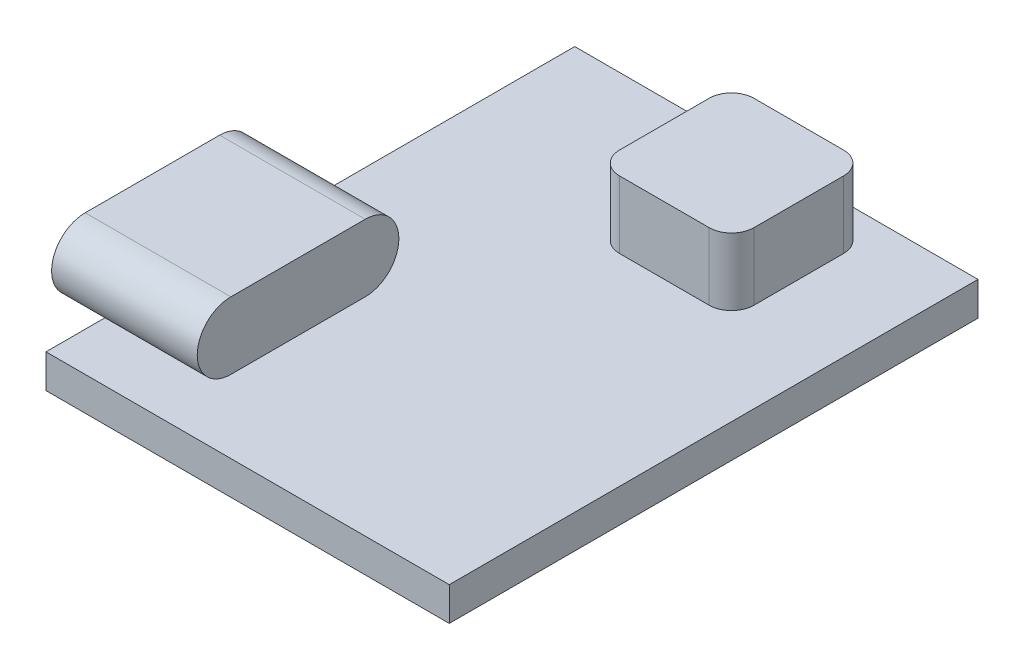
ISO-10303-21;
HEADER;
FILE_DESCRIPTION(('STEP AP214'),'2;1');
FILE_NAME('part.step','',(''),(''),'','','');
FILE_SCHEMA(('AUTOMOTIVE_DESIGN { 1 0 10303 214 1 1 1 1 }'));
ENDSEC;
DATA;
#1=APPLICATION_CONTEXT('core data for automotive mechanical design processes');
#2=APPLICATION_PROTOCOL_DEFINITION('international standard','automotive_design',2000,#1);
#3=PRODUCT_CONTEXT('',#1,'mechanical');
#4=PRODUCT('Part','Part','',(#3));
#5=PRODUCT_RELATED_PRODUCT_CATEGORY('part','',(#4));
#6=PRODUCT_DEFINITION_FORMATION('','',#4);
#7=PRODUCT_DEFINITION_CONTEXT('part definition',#1,'design');
#8=PRODUCT_DEFINITION('design','',#6,#7);
#9=PRODUCT_DEFINITION_SHAPE('','',#8);
#10=(LENGTH_UNIT() NAMED_UNIT(*) SI_UNIT(.MILLI.,.METRE.));
#11=(NAMED_UNIT(*) PLANE_ANGLE_UNIT() SI_UNIT($,.RADIAN.));
#12=(NAMED_UNIT(*) SI_UNIT($,.STERADIAN.) SOLID_ANGLE_UNIT());
#13=UNCERTAINTY_MEASURE_WITH_UNIT(LENGTH_MEASURE(1.E-05),#10,'distance_accuracy_value','');
#14=(GEOMETRIC_REPRESENTATION_CONTEXT(3) GLOBAL_UNCERTAINTY_ASSIGNED_CONTEXT((#13)) GLOBAL_UNIT_ASSIGNED_CONTEXT((#10,
#11,#12)) REPRESENTATION_CONTEXT('',''));
#15=CARTESIAN_POINT('',(0.,0.,0.));
#16=DIRECTION('',(0.,0.,1.));
#17=DIRECTION('',(1.,0.,0.));
#18=AXIS2_PLACEMENT_3D('',#15,#16,#17);
#19=CARTESIAN_POINT('',(-1.,4.5,-10.8));
#20=DIRECTION('',(1.,0.,0.));
#21=DIRECTION('',(0.,0.,-1.));
#22=AXIS2_PLACEMENT_3D('',#19,#20,#21);
#23=PLANE('',#22);
#24=DIRECTION('',(0.,0.,1.));
#25=VECTOR('',#24,1.);
#26=CARTESIAN_POINT('',(-1.,4.5,-10.8));
#27=LINE('',#26,#25);
#28=CARTESIAN_POINT('',(-1.,4.5,-9.8));
#29=VERTEX_POINT('',#28);
#30=CARTESIAN_POINT('',(-1.,4.5,-5.8));
#31=VERTEX_POINT('',#30);
#32=EDGE_CURVE('E144',#29,#31,#27,.T.);
#33=ORIENTED_EDGE('',*,*,#32,.F.);
#34=DIRECTION('',(0.,-1.,0.));
#35=VECTOR('',#34,1.);
#36=CARTESIAN_POINT('',(-1.,4.5,-9.8));
#37=LINE('',#36,#35);
#38=CARTESIAN_POINT('',(-1.,1.5,-9.8));
#39=VERTEX_POINT('',#38);
#40=EDGE_CURVE('E170',#29,#39,#37,.T.);
#41=ORIENTED_EDGE('',*,*,#40,.T.);
#42=DIRECTION('',(0.,0.,1.));
#43=VECTOR('',#42,1.);
#44=CARTESIAN_POINT('',(-1.,1.5,-10.8));
#45=LINE('',#44,#43);
#46=CARTESIAN_POINT('',(-1.,1.5,-5.8));
#47=VERTEX_POINT('',#46);
#48=EDGE_CURVE('E176',#39,#47,#45,.T.);
#49=ORIENTED_EDGE('',*,*,#48,.T.);
#50=DIRECTION('',(0.,-1.,0.));
#51=VECTOR('',#50,1.);
#52=CARTESIAN_POINT('',(-1.,4.5,-5.8));
#53=LINE('',#52,#51);
#54=EDGE_CURVE('E168',#47,#31,#53,.F.);
#55=ORIENTED_EDGE('',*,*,#54,.T.);
#56=EDGE_LOOP('',(#33,#41,#49,#55));
#57=FACE_BOUND('',#56,.T.);
#58=ADVANCED_FACE('F52',(#57),#23,.F.);
#59=CARTESIAN_POINT('',(-1.,4.5,-4.8));
#60=DIRECTION('',(0.,0.,-1.));
#61=DIRECTION('',(-1.,0.,0.));
#62=AXIS2_PLACEMENT_3D('',#59,#60,#61);
#63=PLANE('',#62);
#64=DIRECTION('',(1.,0.,0.));
#65=VECTOR('',#64,1.);
#66=CARTESIAN_POINT('',(-1.,4.5,-4.8));
#67=LINE('',#66,#65);
#68=CARTESIAN_POINT('',(0.,4.5,-4.8));
#69=VERTEX_POINT('',#68);
#70=CARTESIAN_POINT('',(4.,4.5,-4.8));
#71=VERTEX_POINT('',#70);
#72=EDGE_CURVE('E147',#69,#71,#67,.T.);
#73=ORIENTED_EDGE('',*,*,#72,.F.);
#74=DIRECTION('',(0.,-1.,0.));
#75=VECTOR('',#74,1.);
#76=CARTESIAN_POINT('',(0.,4.5,-4.8));
#77=LINE('',#76,#75);
#78=CARTESIAN_POINT('',(0.,1.5,-4.8));
#79=VERTEX_POINT('',#78);
#80=EDGE_CURVE('E12',#69,#79,#77,.T.);
#81=ORIENTED_EDGE('',*,*,#80,.T.);
#82=DIRECTION('',(1.,0.,0.));
#83=VECTOR('',#82,1.);
#84=CARTESIAN_POINT('',(-1.,1.5,-4.8));
#85=LINE('',#84,#83);
#86=CARTESIAN_POINT('',(4.,1.5,-4.8));
#87=VERTEX_POINT('',#86);
#88=EDGE_CURVE('E149',#79,#87,#85,.T.);
#89=ORIENTED_EDGE('',*,*,#88,.T.);
#90=DIRECTION('',(0.,-1.,0.));
#91=VECTOR('',#90,1.);
#92=CARTESIAN_POINT('',(4.,4.5,-4.8));
#93=LINE('',#92,#91);
#94=EDGE_CURVE('E60',#87,#71,#93,.F.);
#95=ORIENTED_EDGE('',*,*,#94,.T.);
#96=EDGE_LOOP('',(#73,#81,#89,#95));
#97=FACE_BOUND('',#96,.T.);
#98=ADVANCED_FACE('F195',(#97),#63,.F.);
#99=CARTESIAN_POINT('',(5.,4.5,-10.8));
#100=DIRECTION('',(-1.,0.,0.));
#101=DIRECTION('',(0.,0.,1.));
#102=AXIS2_PLACEMENT_3D('',#99,#100,#101);
#103=PLANE('',#102);
#104=DIRECTION('',(0.,0.,-1.));
#105=VECTOR('',#104,1.);
#106=CARTESIAN_POINT('',(5.,1.5,-10.8));
#107=LINE('',#106,#105);
#108=CARTESIAN_POINT('',(5.,1.5,-5.8));
#109=VERTEX_POINT('',#108);
#110=CARTESIAN_POINT('',(5.,1.5,-9.8));
#111=VERTEX_POINT('',#110);
#112=EDGE_CURVE('E145',#109,#111,#107,.T.);
#113=ORIENTED_EDGE('',*,*,#112,.T.);
#114=DIRECTION('',(0.,-1.,0.));
#115=VECTOR('',#114,1.);
#116=CARTESIAN_POINT('',(5.,4.5,-9.8));
#117=LINE('',#116,#115);
#118=CARTESIAN_POINT('',(5.,4.5,-9.8));
#119=VERTEX_POINT('',#118);
#120=EDGE_CURVE('E123',#111,#119,#117,.F.);
#121=ORIENTED_EDGE('',*,*,#120,.T.);
#122=DIRECTION('',(0.,0.,-1.));
#123=VECTOR('',#122,1.);
#124=CARTESIAN_POINT('',(5.,4.5,-10.8));
#125=LINE('',#124,#123);
#126=CARTESIAN_POINT('',(5.,4.5,-5.8));
#127=VERTEX_POINT('',#126);
#128=EDGE_CURVE('E184',#127,#119,#125,.T.);
#129=ORIENTED_EDGE('',*,*,#128,.F.);
#130=DIRECTION('',(0.,-1.,0.));
#131=VECTOR('',#130,1.);
#132=CARTESIAN_POINT('',(5.,4.5,-5.8));
#133=LINE('',#132,#131);
#134=EDGE_CURVE('E128',#127,#109,#133,.T.);
#135=ORIENTED_EDGE('',*,*,#134,.T.);
#136=EDGE_LOOP('',(#113,#121,#129,#135));
#137=FACE_BOUND('',#136,.T.);
#138=ADVANCED_FACE('F194',(#137),#103,.F.);
#139=CARTESIAN_POINT('',(-1.,4.5,-10.8));
#140=DIRECTION('',(0.,0.,1.));
#141=DIRECTION('',(1.,0.,0.));
#142=AXIS2_PLACEMENT_3D('',#139,#140,#141);
#143=PLANE('',#142);
#144=DIRECTION('',(-1.,0.,0.));
#145=VECTOR('',#144,1.);
#146=CARTESIAN_POINT('',(-1.,4.5,-10.8));
#147=LINE('',#146,#145);
#148=CARTESIAN_POINT('',(4.,4.5,-10.8));
#149=VERTEX_POINT('',#148);
#150=CARTESIAN_POINT('',(0.,4.5,-10.8));
#151=VERTEX_POINT('',#150);
#152=EDGE_CURVE('E138',#149,#151,#147,.T.);
#153=ORIENTED_EDGE('',*,*,#152,.F.);
#154=DIRECTION('',(0.,-1.,0.));
#155=VECTOR('',#154,1.);
#156=CARTESIAN_POINT('',(4.,4.5,-10.8));
#157=LINE('',#156,#155);
#158=CARTESIAN_POINT('',(4.,1.5,-10.8));
#159=VERTEX_POINT('',#158);
#160=EDGE_CURVE('E122',#149,#159,#157,.T.);
#161=ORIENTED_EDGE('',*,*,#160,.T.);
#162=DIRECTION('',(-1.,0.,0.));
#163=VECTOR('',#162,1.);
#164=CARTESIAN_POINT('',(-1.,1.5,-10.8));
#165=LINE('',#164,#163);
#166=CARTESIAN_POINT('',(0.,1.5,-10.8));
#167=VERTEX_POINT('',#166);
#168=EDGE_CURVE('E135',#159,#167,#165,.T.);
#169=ORIENTED_EDGE('',*,*,#168,.T.);
#170=DIRECTION('',(0.,-1.,0.));
#171=VECTOR('',#170,1.);
#172=CARTESIAN_POINT('',(0.,4.5,-10.8));
#173=LINE('',#172,#171);
#174=EDGE_CURVE('E140',#167,#151,#173,.F.);
#175=ORIENTED_EDGE('',*,*,#174,.T.);
#176=EDGE_LOOP('',(#153,#161,#169,#175));
#177=FACE_BOUND('',#176,.T.);
#178=ADVANCED_FACE('F134',(#177),#143,.F.);
#179=CARTESIAN_POINT('',(0.,4.5,0.));
#180=DIRECTION('',(0.,1.,0.));
#181=DIRECTION('',(0.,0.,1.));
#182=AXIS2_PLACEMENT_3D('',#179,#180,#181);
#183=PLANE('',#182);
#184=ORIENTED_EDGE('',*,*,#128,.T.);
#185=CARTESIAN_POINT('',(4.,4.5,-9.8));
#186=DIRECTION('',(0.,1.,0.));
#187=DIRECTION('',(0.,0.,1.));
#188=AXIS2_PLACEMENT_3D('',#185,#186,#187);
#189=CIRCLE('',#188,1.);
#190=EDGE_CURVE('E166',#119,#149,#189,.T.);
#191=ORIENTED_EDGE('',*,*,#190,.T.);
#192=ORIENTED_EDGE('',*,*,#152,.T.);
#193=CARTESIAN_POINT('',(0.,4.5,-9.8));
#194=DIRECTION('',(0.,1.,0.));
#195=DIRECTION('',(0.,0.,1.));
#196=AXIS2_PLACEMENT_3D('',#193,#194,#195);
#197=CIRCLE('',#196,1.);
#198=EDGE_CURVE('E164',#151,#29,#197,.T.);
#199=ORIENTED_EDGE('',*,*,#198,.T.);
#200=ORIENTED_EDGE('',*,*,#32,.T.);
#201=CARTESIAN_POINT('',(0.,4.5,-5.8));
#202=DIRECTION('',(0.,1.,0.));
#203=DIRECTION('',(0.,0.,1.));
#204=AXIS2_PLACEMENT_3D('',#201,#202,#203);
#205=CIRCLE('',#204,1.);
#206=EDGE_CURVE('E73',#31,#69,#205,.T.);
#207=ORIENTED_EDGE('',*,*,#206,.T.);
#208=ORIENTED_EDGE('',*,*,#72,.T.);
#209=CARTESIAN_POINT('',(4.,4.5,-5.8));
#210=DIRECTION('',(0.,1.,0.));
#211=DIRECTION('',(0.,0.,1.));
#212=AXIS2_PLACEMENT_3D('',#209,#210,#211);
#213=CIRCLE('',#212,1.);
#214=EDGE_CURVE('E161',#71,#127,#213,.T.);
#215=ORIENTED_EDGE('',*,*,#214,.T.);
#216=EDGE_LOOP('',(#184,#191,#192,#199,#200,#207,#208,#215));
#217=FACE_BOUND('',#216,.T.);
#218=ADVANCED_FACE('F188',(#217),#183,.T.);
#219=CARTESIAN_POINT('',(0.,1.5,0.));
#220=DIRECTION('',(0.,1.,0.));
#221=DIRECTION('',(0.,0.,1.));
#222=AXIS2_PLACEMENT_3D('',#219,#220,#221);
#223=PLANE('',#222);
#224=ORIENTED_EDGE('',*,*,#168,.F.);
#225=CARTESIAN_POINT('',(4.,1.5,-9.8));
#226=DIRECTION('',(0.,1.,0.));
#227=DIRECTION('',(0.,0.,1.));
#228=AXIS2_PLACEMENT_3D('',#225,#226,#227);
#229=CIRCLE('',#228,1.);
#230=EDGE_CURVE('E118',#159,#111,#229,.F.);
#231=ORIENTED_EDGE('',*,*,#230,.T.);
#232=ORIENTED_EDGE('',*,*,#112,.F.);
#233=CARTESIAN_POINT('',(4.,1.5,-5.8));
#234=DIRECTION('',(0.,1.,0.));
#235=DIRECTION('',(0.,0.,1.));
#236=AXIS2_PLACEMENT_3D('',#233,#234,#235);
#237=CIRCLE('',#236,1.);
#238=EDGE_CURVE('E139',#109,#87,#237,.F.);
#239=ORIENTED_EDGE('',*,*,#238,.T.);
#240=ORIENTED_EDGE('',*,*,#88,.F.);
#241=CARTESIAN_POINT('',(0.,1.5,-5.8));
#242=DIRECTION('',(0.,1.,0.));
#243=DIRECTION('',(0.,0.,1.));
#244=AXIS2_PLACEMENT_3D('',#241,#242,#243);
#245=CIRCLE('',#244,1.);
#246=EDGE_CURVE('E155',#79,#47,#245,.F.);
#247=ORIENTED_EDGE('',*,*,#246,.T.);
#248=ORIENTED_EDGE('',*,*,#48,.F.);
#249=CARTESIAN_POINT('',(0.,1.5,-9.8));
#250=DIRECTION('',(0.,1.,0.));
#251=DIRECTION('',(0.,0.,1.));
#252=AXIS2_PLACEMENT_3D('',#249,#250,#251);
#253=CIRCLE('',#252,1.);
#254=EDGE_CURVE('E129',#39,#167,#253,.F.);
#255=ORIENTED_EDGE('',*,*,#254,.T.);
#256=EDGE_LOOP('',(#224,#231,#232,#239,#240,#247,#248,#255));
#257=FACE_BOUND('',#256,.T.);
#258=ADVANCED_FACE('F142',(#257),#223,.F.);
#259=CARTESIAN_POINT('',(4.,4.5,-9.8));
#260=DIRECTION('',(0.,-1.,0.));
#261=DIRECTION('',(0.,0.,-1.));
#262=AXIS2_PLACEMENT_3D('',#259,#260,#261);
#263=CYLINDRICAL_SURFACE('',#262,1.);
#264=ORIENTED_EDGE('',*,*,#190,.F.);
#265=ORIENTED_EDGE('',*,*,#120,.F.);
#266=ORIENTED_EDGE('',*,*,#230,.F.);
#267=ORIENTED_EDGE('',*,*,#160,.F.);
#268=EDGE_LOOP('',(#264,#265,#266,#267));
#269=FACE_BOUND('',#268,.T.);
#270=ADVANCED_FACE('F121',(#269),#263,.T.);
#271=CARTESIAN_POINT('',(0.,4.5,-9.8));
#272=DIRECTION('',(0.,-1.,0.));
#273=DIRECTION('',(0.,0.,-1.));
#274=AXIS2_PLACEMENT_3D('',#271,#272,#273);
#275=CYLINDRICAL_SURFACE('',#274,1.);
#276=ORIENTED_EDGE('',*,*,#198,.F.);
#277=ORIENTED_EDGE('',*,*,#174,.F.);
#278=ORIENTED_EDGE('',*,*,#254,.F.);
#279=ORIENTED_EDGE('',*,*,#40,.F.);
#280=EDGE_LOOP('',(#276,#277,#278,#279));
#281=FACE_BOUND('',#280,.T.);
#282=ADVANCED_FACE('F198',(#281),#275,.T.);
#283=CARTESIAN_POINT('',(0.,4.5,-5.8));
#284=DIRECTION('',(0.,-1.,0.));
#285=DIRECTION('',(0.,0.,-1.));
#286=AXIS2_PLACEMENT_3D('',#283,#284,#285);
#287=CYLINDRICAL_SURFACE('',#286,1.);
#288=ORIENTED_EDGE('',*,*,#206,.F.);
#289=ORIENTED_EDGE('',*,*,#54,.F.);
#290=ORIENTED_EDGE('',*,*,#246,.F.);
#291=ORIENTED_EDGE('',*,*,#80,.F.);
#292=EDGE_LOOP('',(#288,#289,#290,#291));
#293=FACE_BOUND('',#292,.T.);
#294=ADVANCED_FACE('F197',(#293),#287,.T.);
#295=CARTESIAN_POINT('',(4.,4.5,-5.8));
#296=DIRECTION('',(0.,-1.,0.));
#297=DIRECTION('',(0.,0.,-1.));
#298=AXIS2_PLACEMENT_3D('',#295,#296,#297);
#299=CYLINDRICAL_SURFACE('',#298,1.);
#300=ORIENTED_EDGE('',*,*,#214,.F.);
#301=ORIENTED_EDGE('',*,*,#94,.F.);
#302=ORIENTED_EDGE('',*,*,#238,.F.);
#303=ORIENTED_EDGE('',*,*,#134,.F.);
#304=EDGE_LOOP('',(#300,#301,#302,#303));
#305=FACE_BOUND('',#304,.T.);
#306=ADVANCED_FACE('F54',(#305),#299,.T.);
#307=CLOSED_SHELL('',(#58,#98,#138,#178,#218,#258,#270,#282,#294,#306));
#308=MANIFOLD_SOLID_BREP('B2',#307);
#309=CARTESIAN_POINT('',(-4.,3.,2.55));
#310=DIRECTION('',(-1.,0.,0.));
#311=DIRECTION('',(0.,0.,1.));
#312=AXIS2_PLACEMENT_3D('',#309,#310,#311);
#313=CYLINDRICAL_SURFACE('',#312,1.5);
#314=DIRECTION('',(-1.,0.,0.));
#315=VECTOR('',#314,1.);
#316=CARTESIAN_POINT('',(-4.,1.5,2.55));
#317=LINE('',#316,#315);
#318=CARTESIAN_POINT('',(-4.,1.5,2.55));
#319=VERTEX_POINT('',#318);
#320=CARTESIAN_POINT('',(-10.5,1.5,2.55));
#321=VERTEX_POINT('',#320);
#322=EDGE_CURVE('E292',#319,#321,#317,.T.);
#323=ORIENTED_EDGE('',*,*,#322,.T.);
#324=CARTESIAN_POINT('',(-10.5,3.,2.55));
#325=DIRECTION('',(-1.,0.,0.));
#326=DIRECTION('',(0.,0.,1.));
#327=AXIS2_PLACEMENT_3D('',#324,#325,#326);
#328=CIRCLE('',#327,1.5);
#329=CARTESIAN_POINT('',(-10.5,4.5,2.55));
#330=VERTEX_POINT('',#329);
#331=EDGE_CURVE('E394',#330,#321,#328,.T.);
#332=ORIENTED_EDGE('',*,*,#331,.F.);
#333=DIRECTION('',(-1.,0.,0.));
#334=VECTOR('',#333,1.);
#335=CARTESIAN_POINT('',(-4.,4.5,2.55));
#336=LINE('',#335,#334);
#337=CARTESIAN_POINT('',(-4.,4.5,2.55));
#338=VERTEX_POINT('',#337);
#339=EDGE_CURVE('E50',#338,#330,#336,.T.);
#340=ORIENTED_EDGE('',*,*,#339,.F.);
#341=CARTESIAN_POINT('',(-4.,3.,2.55));
#342=DIRECTION('',(-1.,0.,0.));
#343=DIRECTION('',(0.,0.,1.));
#344=AXIS2_PLACEMENT_3D('',#341,#342,#343);
#345=CIRCLE('',#344,1.5);
#346=EDGE_CURVE('E406',#338,#319,#345,.T.);
#347=ORIENTED_EDGE('',*,*,#346,.T.);
#348=EDGE_LOOP('',(#323,#332,#340,#347));
#349=FACE_BOUND('',#348,.T.);
#350=ADVANCED_FACE('F289',(#349),#313,.T.);
#351=CARTESIAN_POINT('',(-4.,4.5,2.55));
#352=DIRECTION('',(0.,1.,0.));
#353=DIRECTION('',(0.,0.,1.));
#354=AXIS2_PLACEMENT_3D('',#351,#352,#353);
#355=PLANE('',#354);
#356=ORIENTED_EDGE('',*,*,#339,.T.);
#357=DIRECTION('',(0.,0.,-1.));
#358=VECTOR('',#357,1.);
#359=CARTESIAN_POINT('',(-10.5,4.5,2.55));
#360=LINE('',#359,#358);
#361=CARTESIAN_POINT('',(-10.5,4.5,8.55));
#362=VERTEX_POINT('',#361);
#363=EDGE_CURVE('E403',#362,#330,#360,.T.);
#364=ORIENTED_EDGE('',*,*,#363,.F.);
#365=DIRECTION('',(-1.,0.,0.));
#366=VECTOR('',#365,1.);
#367=CARTESIAN_POINT('',(-4.,4.5,8.55));
#368=LINE('',#367,#366);
#369=CARTESIAN_POINT('',(-4.,4.5,8.55));
#370=VERTEX_POINT('',#369);
#371=EDGE_CURVE('E297',#370,#362,#368,.T.);
#372=ORIENTED_EDGE('',*,*,#371,.F.);
#373=DIRECTION('',(0.,0.,-1.));
#374=VECTOR('',#373,1.);
#375=CARTESIAN_POINT('',(-4.,4.5,2.55));
#376=LINE('',#375,#374);
#377=EDGE_CURVE('E414',#370,#338,#376,.T.);
#378=ORIENTED_EDGE('',*,*,#377,.T.);
#379=EDGE_LOOP('',(#356,#364,#372,#378));
#380=FACE_BOUND('',#379,.T.);
#381=ADVANCED_FACE('F427',(#380),#355,.T.);
#382=CARTESIAN_POINT('',(-4.,3.,8.55));
#383=DIRECTION('',(-1.,0.,0.));
#384=DIRECTION('',(0.,0.,1.));
#385=AXIS2_PLACEMENT_3D('',#382,#383,#384);
#386=CYLINDRICAL_SURFACE('',#385,1.5);
#387=ORIENTED_EDGE('',*,*,#371,.T.);
#388=CARTESIAN_POINT('',(-10.5,3.,8.55));
#389=DIRECTION('',(-1.,0.,0.));
#390=DIRECTION('',(0.,0.,1.));
#391=AXIS2_PLACEMENT_3D('',#388,#389,#390);
#392=CIRCLE('',#391,1.5);
#393=CARTESIAN_POINT('',(-10.5,1.5,8.55));
#394=VERTEX_POINT('',#393);
#395=EDGE_CURVE('E400',#394,#362,#392,.T.);
#396=ORIENTED_EDGE('',*,*,#395,.F.);
#397=DIRECTION('',(-1.,0.,0.));
#398=VECTOR('',#397,1.);
#399=CARTESIAN_POINT('',(-4.,1.5,8.55));
#400=LINE('',#399,#398);
#401=CARTESIAN_POINT('',(-4.,1.5,8.55));
#402=VERTEX_POINT('',#401);
#403=EDGE_CURVE('E417',#402,#394,#400,.T.);
#404=ORIENTED_EDGE('',*,*,#403,.F.);
#405=CARTESIAN_POINT('',(-4.,3.,8.55));
#406=DIRECTION('',(-1.,0.,0.));
#407=DIRECTION('',(0.,0.,1.));
#408=AXIS2_PLACEMENT_3D('',#405,#406,#407);
#409=CIRCLE('',#408,1.5);
#410=EDGE_CURVE('E411',#402,#370,#409,.T.);
#411=ORIENTED_EDGE('',*,*,#410,.T.);
#412=EDGE_LOOP('',(#387,#396,#404,#411));
#413=FACE_BOUND('',#412,.T.);
#414=ADVANCED_FACE('F433',(#413),#386,.T.);
#415=CARTESIAN_POINT('',(-4.,1.5,2.55));
#416=DIRECTION('',(0.,-1.,0.));
#417=DIRECTION('',(0.,0.,-1.));
#418=AXIS2_PLACEMENT_3D('',#415,#416,#417);
#419=PLANE('',#418);
#420=ORIENTED_EDGE('',*,*,#403,.T.);
#421=DIRECTION('',(0.,0.,1.));
#422=VECTOR('',#421,1.);
#423=CARTESIAN_POINT('',(-10.5,1.5,2.55));
#424=LINE('',#423,#422);
#425=EDGE_CURVE('E397',#321,#394,#424,.T.);
#426=ORIENTED_EDGE('',*,*,#425,.F.);
#427=ORIENTED_EDGE('',*,*,#322,.F.);
#428=DIRECTION('',(0.,0.,1.));
#429=VECTOR('',#428,1.);
#430=CARTESIAN_POINT('',(-4.,1.5,2.55));
#431=LINE('',#430,#429);
#432=EDGE_CURVE('E408',#319,#402,#431,.T.);
#433=ORIENTED_EDGE('',*,*,#432,.T.);
#434=EDGE_LOOP('',(#420,#426,#427,#433));
#435=FACE_BOUND('',#434,.T.);
#436=ADVANCED_FACE('F421',(#435),#419,.T.);
#437=CARTESIAN_POINT('',(-4.,3.,2.55));
#438=DIRECTION('',(-1.,0.,0.));
#439=DIRECTION('',(0.,0.,1.));
#440=AXIS2_PLACEMENT_3D('',#437,#438,#439);
#441=PLANE('',#440);
#442=ORIENTED_EDGE('',*,*,#346,.F.);
#443=ORIENTED_EDGE('',*,*,#377,.F.);
#444=ORIENTED_EDGE('',*,*,#410,.F.);
#445=ORIENTED_EDGE('',*,*,#432,.F.);
#446=EDGE_LOOP('',(#442,#443,#444,#445));
#447=FACE_BOUND('',#446,.T.);
#448=ADVANCED_FACE('F431',(#447),#441,.F.);
#449=CARTESIAN_POINT('',(-10.5,3.,2.55));
#450=DIRECTION('',(-1.,0.,0.));
#451=DIRECTION('',(0.,0.,1.));
#452=AXIS2_PLACEMENT_3D('',#449,#450,#451);
#453=PLANE('',#452);
#454=CARTESIAN_POINT('',(-10.5,3.,2.55));
#455=DIRECTION('',(-1.,0.,0.));
#456=DIRECTION('',(0.,0.,1.));
#457=AXIS2_PLACEMENT_3D('',#454,#455,#456);
#458=CIRCLE('',#457,1.2);
#459=CARTESIAN_POINT('',(-10.5,4.2,2.55));
#460=VERTEX_POINT('',#459);
#461=CARTESIAN_POINT('',(-10.5,1.8,2.55));
#462=VERTEX_POINT('',#461);
#463=EDGE_CURVE('E361',#460,#462,#458,.T.);
#464=ORIENTED_EDGE('',*,*,#463,.F.);
#465=DIRECTION('',(0.,0.,-1.));
#466=VECTOR('',#465,1.);
#467=CARTESIAN_POINT('',(-10.5,4.2,2.55));
#468=LINE('',#467,#466);
#469=CARTESIAN_POINT('',(-10.5,4.2,8.55));
#470=VERTEX_POINT('',#469);
#471=EDGE_CURVE('E378',#470,#460,#468,.T.);
#472=ORIENTED_EDGE('',*,*,#471,.F.);
#473=CARTESIAN_POINT('',(-10.5,3.,8.55));
#474=DIRECTION('',(-1.,0.,0.));
#475=DIRECTION('',(0.,0.,1.));
#476=AXIS2_PLACEMENT_3D('',#473,#474,#475);
#477=CIRCLE('',#476,1.2);
#478=CARTESIAN_POINT('',(-10.5,1.8,8.55));
#479=VERTEX_POINT('',#478);
#480=EDGE_CURVE('E305',#479,#470,#477,.T.);
#481=ORIENTED_EDGE('',*,*,#480,.F.);
#482=DIRECTION('',(0.,0.,1.));
#483=VECTOR('',#482,1.);
#484=CARTESIAN_POINT('',(-10.5,1.8,2.55));
#485=LINE('',#484,#483);
#486=EDGE_CURVE('E391',#462,#479,#485,.T.);
#487=ORIENTED_EDGE('',*,*,#486,.F.);
#488=EDGE_LOOP('',(#464,#472,#481,#487));
#489=FACE_BOUND('',#488,.T.);
#490=ORIENTED_EDGE('',*,*,#331,.T.);
#491=ORIENTED_EDGE('',*,*,#425,.T.);
#492=ORIENTED_EDGE('',*,*,#395,.T.);
#493=ORIENTED_EDGE('',*,*,#363,.T.);
#494=EDGE_LOOP('',(#490,#491,#492,#493));
#495=FACE_BOUND('',#494,.T.);
#496=ADVANCED_FACE('F424',(#489,#495),#453,.T.);
#497=CARTESIAN_POINT('',(-4.,3.,2.55));
#498=DIRECTION('',(-1.,0.,0.));
#499=DIRECTION('',(0.,0.,1.));
#500=AXIS2_PLACEMENT_3D('',#497,#498,#499);
#501=CYLINDRICAL_SURFACE('',#500,1.2);
#502=DIRECTION('',(-1.,0.,0.));
#503=VECTOR('',#502,1.);
#504=CARTESIAN_POINT('',(-4.,1.8,2.55));
#505=LINE('',#504,#503);
#506=CARTESIAN_POINT('',(-4.3,1.8,2.55));
#507=VERTEX_POINT('',#506);
#508=EDGE_CURVE('E354',#507,#462,#505,.T.);
#509=ORIENTED_EDGE('',*,*,#508,.F.);
#510=CARTESIAN_POINT('',(-4.3,3.,2.55));
#511=DIRECTION('',(-1.,0.,0.));
#512=DIRECTION('',(0.,0.,1.));
#513=AXIS2_PLACEMENT_3D('',#510,#511,#512);
#514=CIRCLE('',#513,1.2);
#515=CARTESIAN_POINT('',(-4.3,4.2,2.55));
#516=VERTEX_POINT('',#515);
#517=EDGE_CURVE('E358',#516,#507,#514,.T.);
#518=ORIENTED_EDGE('',*,*,#517,.F.);
#519=DIRECTION('',(1.,0.,0.));
#520=VECTOR('',#519,1.);
#521=CARTESIAN_POINT('',(-4.,4.2,2.55));
#522=LINE('',#521,#520);
#523=EDGE_CURVE('E384',#516,#460,#522,.F.);
#524=ORIENTED_EDGE('',*,*,#523,.T.);
#525=ORIENTED_EDGE('',*,*,#463,.T.);
#526=EDGE_LOOP('',(#509,#518,#524,#525));
#527=FACE_BOUND('',#526,.T.);
#528=ADVANCED_FACE('F356',(#527),#501,.F.);
#529=CARTESIAN_POINT('',(-4.,4.2,2.55));
#530=DIRECTION('',(0.,1.,0.));
#531=DIRECTION('',(0.,0.,1.));
#532=AXIS2_PLACEMENT_3D('',#529,#530,#531);
#533=PLANE('',#532);
#534=ORIENTED_EDGE('',*,*,#523,.F.);
#535=DIRECTION('',(0.,0.,-1.));
#536=VECTOR('',#535,1.);
#537=CARTESIAN_POINT('',(-4.3,4.2,2.55));
#538=LINE('',#537,#536);
#539=CARTESIAN_POINT('',(-4.3,4.2,8.55));
#540=VERTEX_POINT('',#539);
#541=EDGE_CURVE('E366',#540,#516,#538,.T.);
#542=ORIENTED_EDGE('',*,*,#541,.F.);
#543=DIRECTION('',(-1.,0.,0.));
#544=VECTOR('',#543,1.);
#545=CARTESIAN_POINT('',(-4.,4.2,8.55));
#546=LINE('',#545,#544);
#547=EDGE_CURVE('E385',#540,#470,#546,.T.);
#548=ORIENTED_EDGE('',*,*,#547,.T.);
#549=ORIENTED_EDGE('',*,*,#471,.T.);
#550=EDGE_LOOP('',(#534,#542,#548,#549));
#551=FACE_BOUND('',#550,.T.);
#552=ADVANCED_FACE('F486',(#551),#533,.F.);
#553=CARTESIAN_POINT('',(-4.,3.,8.55));
#554=DIRECTION('',(-1.,0.,0.));
#555=DIRECTION('',(0.,0.,1.));
#556=AXIS2_PLACEMENT_3D('',#553,#554,#555);
#557=CYLINDRICAL_SURFACE('',#556,1.2);
#558=ORIENTED_EDGE('',*,*,#547,.F.);
#559=CARTESIAN_POINT('',(-4.3,3.,8.55));
#560=DIRECTION('',(-1.,0.,0.));
#561=DIRECTION('',(0.,0.,1.));
#562=AXIS2_PLACEMENT_3D('',#559,#560,#561);
#563=CIRCLE('',#562,1.2);
#564=CARTESIAN_POINT('',(-4.3,1.8,8.55));
#565=VERTEX_POINT('',#564);
#566=EDGE_CURVE('E374',#565,#540,#563,.T.);
#567=ORIENTED_EDGE('',*,*,#566,.F.);
#568=DIRECTION('',(1.,0.,0.));
#569=VECTOR('',#568,1.);
#570=CARTESIAN_POINT('',(-4.,1.8,8.55));
#571=LINE('',#570,#569);
#572=EDGE_CURVE('E365',#565,#479,#571,.F.);
#573=ORIENTED_EDGE('',*,*,#572,.T.);
#574=ORIENTED_EDGE('',*,*,#480,.T.);
#575=EDGE_LOOP('',(#558,#567,#573,#574));
#576=FACE_BOUND('',#575,.T.);
#577=ADVANCED_FACE('F495',(#576),#557,.F.);
#578=CARTESIAN_POINT('',(-4.,1.8,2.55));
#579=DIRECTION('',(0.,-1.,0.));
#580=DIRECTION('',(0.,0.,-1.));
#581=AXIS2_PLACEMENT_3D('',#578,#579,#580);
#582=PLANE('',#581);
#583=ORIENTED_EDGE('',*,*,#572,.F.);
#584=DIRECTION('',(0.,0.,1.));
#585=VECTOR('',#584,1.);
#586=CARTESIAN_POINT('',(-4.3,1.8,2.55));
#587=LINE('',#586,#585);
#588=EDGE_CURVE('E369',#507,#565,#587,.T.);
#589=ORIENTED_EDGE('',*,*,#588,.F.);
#590=ORIENTED_EDGE('',*,*,#508,.T.);
#591=ORIENTED_EDGE('',*,*,#486,.T.);
#592=EDGE_LOOP('',(#583,#589,#590,#591));
#593=FACE_BOUND('',#592,.T.);
#594=ADVANCED_FACE('F370',(#593),#582,.F.);
#595=CARTESIAN_POINT('',(-4.3,3.,2.55));
#596=DIRECTION('',(-1.,0.,0.));
#597=DIRECTION('',(0.,0.,1.));
#598=AXIS2_PLACEMENT_3D('',#595,#596,#597);
#599=PLANE('',#598);
#600=ORIENTED_EDGE('',*,*,#517,.T.);
#601=ORIENTED_EDGE('',*,*,#588,.T.);
#602=ORIENTED_EDGE('',*,*,#566,.T.);
#603=ORIENTED_EDGE('',*,*,#541,.T.);
#604=EDGE_LOOP('',(#600,#601,#602,#603));
#605=FACE_BOUND('',#604,.T.);
#606=ADVANCED_FACE('F376',(#605),#599,.T.);
#607=CLOSED_SHELL('',(#350,#381,#414,#436,#448,#496,#528,#552,#577,#594,#606));
#608=MANIFOLD_SOLID_BREP('B6',#607);
#609=CARTESIAN_POINT('',(9.,1.5,-11.8));
#610=DIRECTION('',(-1.,0.,0.));
#611=DIRECTION('',(0.,0.,1.));
#612=AXIS2_PLACEMENT_3D('',#609,#610,#611);
#613=PLANE('',#612);
#614=DIRECTION('',(0.,0.,-1.));
#615=VECTOR('',#614,1.);
#616=CARTESIAN_POINT('',(9.,0.,-11.8));
#617=LINE('',#616,#615);
#618=CARTESIAN_POINT('',(9.,0.,11.8));
#619=VERTEX_POINT('',#618);
#620=CARTESIAN_POINT('',(9.,0.,-11.8));
#621=VERTEX_POINT('',#620);
#622=EDGE_CURVE('E591',#619,#621,#617,.T.);
#623=ORIENTED_EDGE('',*,*,#622,.T.);
#624=DIRECTION('',(0.,-1.,0.));
#625=VECTOR('',#624,1.);
#626=CARTESIAN_POINT('',(9.,1.5,-11.8));
#627=LINE('',#626,#625);
#628=CARTESIAN_POINT('',(9.,1.5,-11.8));
#629=VERTEX_POINT('',#628);
#630=EDGE_CURVE('E287',#629,#621,#627,.T.);
#631=ORIENTED_EDGE('',*,*,#630,.F.);
#632=DIRECTION('',(0.,0.,-1.));
#633=VECTOR('',#632,1.);
#634=CARTESIAN_POINT('',(9.,1.5,-11.8));
#635=LINE('',#634,#633);
#636=CARTESIAN_POINT('',(9.,1.5,11.8));
#637=VERTEX_POINT('',#636);
#638=EDGE_CURVE('E579',#637,#629,#635,.T.);
#639=ORIENTED_EDGE('',*,*,#638,.F.);
#640=DIRECTION('',(0.,-1.,0.));
#641=VECTOR('',#640,1.);
#642=CARTESIAN_POINT('',(9.,1.5,11.8));
#643=LINE('',#642,#641);
#644=EDGE_CURVE('E587',#637,#619,#643,.T.);
#645=ORIENTED_EDGE('',*,*,#644,.T.);
#646=EDGE_LOOP('',(#623,#631,#639,#645));
#647=FACE_BOUND('',#646,.T.);
#648=ADVANCED_FACE('F528',(#647),#613,.F.);
#649=CARTESIAN_POINT('',(-9.,1.5,-11.8));
#650=DIRECTION('',(0.,0.,1.));
#651=DIRECTION('',(1.,0.,0.));
#652=AXIS2_PLACEMENT_3D('',#649,#650,#651);
#653=PLANE('',#652);
#654=DIRECTION('',(-1.,0.,0.));
#655=VECTOR('',#654,1.);
#656=CARTESIAN_POINT('',(-9.,0.,-11.8));
#657=LINE('',#656,#655);
#658=CARTESIAN_POINT('',(-9.,0.,-11.8));
#659=VERTEX_POINT('',#658);
#660=EDGE_CURVE('E583',#621,#659,#657,.T.);
#661=ORIENTED_EDGE('',*,*,#660,.T.);
#662=DIRECTION('',(0.,-1.,0.));
#663=VECTOR('',#662,1.);
#664=CARTESIAN_POINT('',(-9.,1.5,-11.8));
#665=LINE('',#664,#663);
#666=CARTESIAN_POINT('',(-9.,1.5,-11.8));
#667=VERTEX_POINT('',#666);
#668=EDGE_CURVE('E536',#667,#659,#665,.T.);
#669=ORIENTED_EDGE('',*,*,#668,.F.);
#670=DIRECTION('',(-1.,0.,0.));
#671=VECTOR('',#670,1.);
#672=CARTESIAN_POINT('',(-9.,1.5,-11.8));
#673=LINE('',#672,#671);
#674=EDGE_CURVE('E574',#629,#667,#673,.T.);
#675=ORIENTED_EDGE('',*,*,#674,.F.);
#676=ORIENTED_EDGE('',*,*,#630,.T.);
#677=EDGE_LOOP('',(#661,#669,#675,#676));
#678=FACE_BOUND('',#677,.T.);
#679=ADVANCED_FACE('F582',(#678),#653,.F.);
#680=CARTESIAN_POINT('',(-9.,1.5,-11.8));
#681=DIRECTION('',(1.,0.,0.));
#682=DIRECTION('',(0.,0.,-1.));
#683=AXIS2_PLACEMENT_3D('',#680,#681,#682);
#684=PLANE('',#683);
#685=DIRECTION('',(0.,0.,1.));
#686=VECTOR('',#685,1.);
#687=CARTESIAN_POINT('',(-9.,0.,-11.8));
#688=LINE('',#687,#686);
#689=CARTESIAN_POINT('',(-9.,0.,11.8));
#690=VERTEX_POINT('',#689);
#691=EDGE_CURVE('E561',#659,#690,#688,.T.);
#692=ORIENTED_EDGE('',*,*,#691,.T.);
#693=DIRECTION('',(0.,-1.,0.));
#694=VECTOR('',#693,1.);
#695=CARTESIAN_POINT('',(-9.,1.5,11.8));
#696=LINE('',#695,#694);
#697=CARTESIAN_POINT('',(-9.,1.5,11.8));
#698=VERTEX_POINT('',#697);
#699=EDGE_CURVE('E584',#698,#690,#696,.T.);
#700=ORIENTED_EDGE('',*,*,#699,.F.);
#701=DIRECTION('',(0.,0.,1.));
#702=VECTOR('',#701,1.);
#703=CARTESIAN_POINT('',(-9.,1.5,-11.8));
#704=LINE('',#703,#702);
#705=EDGE_CURVE('E577',#667,#698,#704,.T.);
#706=ORIENTED_EDGE('',*,*,#705,.F.);
#707=ORIENTED_EDGE('',*,*,#668,.T.);
#708=EDGE_LOOP('',(#692,#700,#706,#707));
#709=FACE_BOUND('',#708,.T.);
#710=ADVANCED_FACE('F585',(#709),#684,.F.);
#711=CARTESIAN_POINT('',(-9.,1.5,11.8));
#712=DIRECTION('',(0.,0.,-1.));
#713=DIRECTION('',(-1.,0.,0.));
#714=AXIS2_PLACEMENT_3D('',#711,#712,#713);
#715=PLANE('',#714);
#716=DIRECTION('',(1.,0.,0.));
#717=VECTOR('',#716,1.);
#718=CARTESIAN_POINT('',(-9.,0.,11.8));
#719=LINE('',#718,#717);
#720=EDGE_CURVE('E567',#690,#619,#719,.T.);
#721=ORIENTED_EDGE('',*,*,#720,.T.);
#722=ORIENTED_EDGE('',*,*,#644,.F.);
#723=DIRECTION('',(1.,0.,0.));
#724=VECTOR('',#723,1.);
#725=CARTESIAN_POINT('',(-9.,1.5,11.8));
#726=LINE('',#725,#724);
#727=EDGE_CURVE('E544',#698,#637,#726,.T.);
#728=ORIENTED_EDGE('',*,*,#727,.F.);
#729=ORIENTED_EDGE('',*,*,#699,.T.);
#730=EDGE_LOOP('',(#721,#722,#728,#729));
#731=FACE_BOUND('',#730,.T.);
#732=ADVANCED_FACE('F598',(#731),#715,.F.);
#733=CARTESIAN_POINT('',(0.,1.5,0.));
#734=DIRECTION('',(0.,1.,0.));
#735=DIRECTION('',(0.,0.,1.));
#736=AXIS2_PLACEMENT_3D('',#733,#734,#735);
#737=PLANE('',#736);
#738=ORIENTED_EDGE('',*,*,#638,.T.);
#739=ORIENTED_EDGE('',*,*,#674,.T.);
#740=ORIENTED_EDGE('',*,*,#705,.T.);
#741=ORIENTED_EDGE('',*,*,#727,.T.);
#742=EDGE_LOOP('',(#738,#739,#740,#741));
#743=FACE_BOUND('',#742,.T.);
#744=ADVANCED_FACE('F575',(#743),#737,.T.);
#745=CARTESIAN_POINT('',(0.,0.,0.));
#746=DIRECTION('',(0.,1.,0.));
#747=DIRECTION('',(0.,0.,1.));
#748=AXIS2_PLACEMENT_3D('',#745,#746,#747);
#749=PLANE('',#748);
#750=ORIENTED_EDGE('',*,*,#622,.F.);
#751=ORIENTED_EDGE('',*,*,#720,.F.);
#752=ORIENTED_EDGE('',*,*,#691,.F.);
#753=ORIENTED_EDGE('',*,*,#660,.F.);
#754=EDGE_LOOP('',(#750,#751,#752,#753));
#755=FACE_BOUND('',#754,.T.);
#756=ADVANCED_FACE('F601',(#755),#749,.F.);
#757=CLOSED_SHELL('',(#648,#679,#710,#732,#744,#756));
#758=MANIFOLD_SOLID_BREP('B44',#757);
#759=ADVANCED_BREP_SHAPE_REPRESENTATION('',(#18,#308,#608,#758),#14);
#760=SHAPE_DEFINITION_REPRESENTATION(#9,#759);
ENDSEC;
END-ISO-10303-21;
